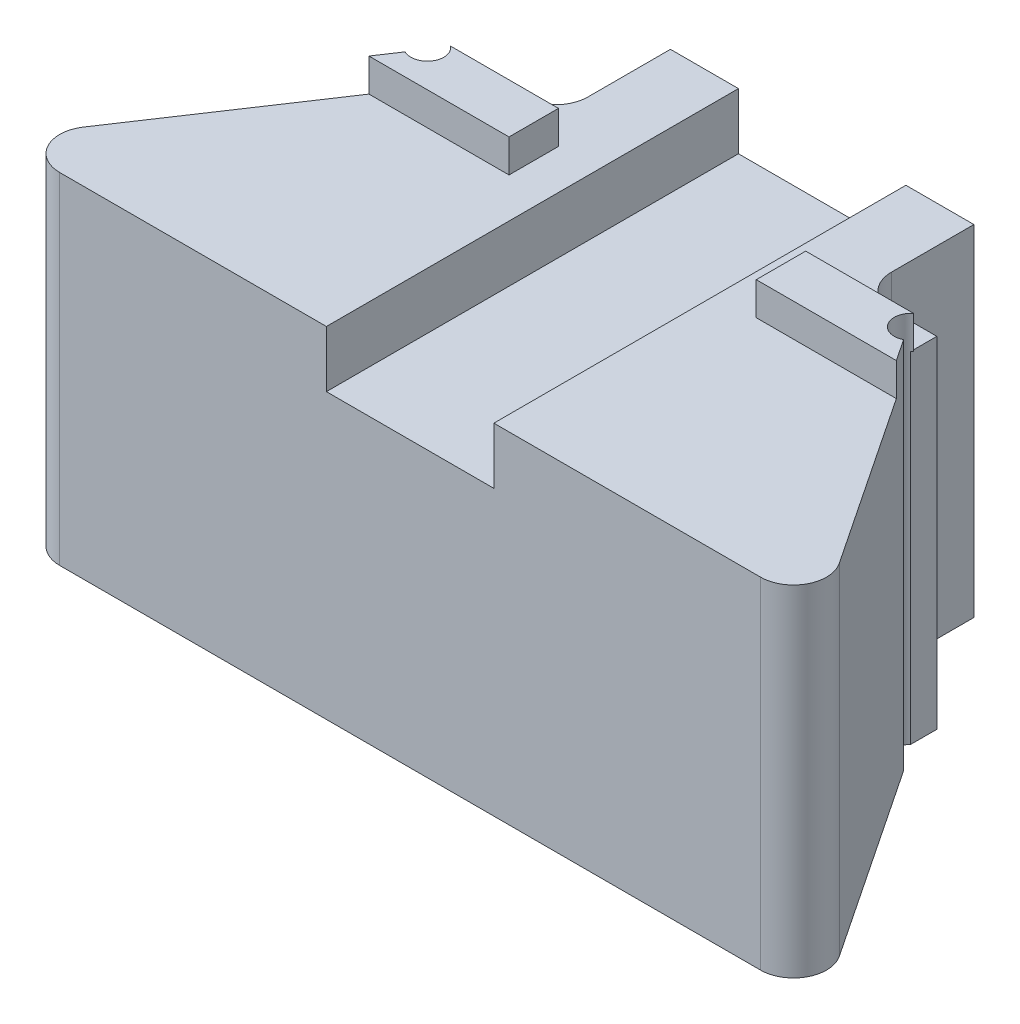
ISO-10303-21;
HEADER;
FILE_DESCRIPTION(('STEP AP214'),'2;1');
FILE_NAME('part.step','',(''),(''),'','','');
FILE_SCHEMA(('AUTOMOTIVE_DESIGN { 1 0 10303 214 1 1 1 1 }'));
ENDSEC;
DATA;
#1=APPLICATION_CONTEXT('core data for automotive mechanical design processes');
#2=APPLICATION_PROTOCOL_DEFINITION('international standard','automotive_design',2000,#1);
#3=PRODUCT_CONTEXT('',#1,'mechanical');
#4=PRODUCT('Part','Part','',(#3));
#5=PRODUCT_RELATED_PRODUCT_CATEGORY('part','',(#4));
#6=PRODUCT_DEFINITION_FORMATION('','',#4);
#7=PRODUCT_DEFINITION_CONTEXT('part definition',#1,'design');
#8=PRODUCT_DEFINITION('design','',#6,#7);
#9=PRODUCT_DEFINITION_SHAPE('','',#8);
#10=(LENGTH_UNIT() NAMED_UNIT(*) SI_UNIT(.MILLI.,.METRE.));
#11=(NAMED_UNIT(*) PLANE_ANGLE_UNIT() SI_UNIT($,.RADIAN.));
#12=(NAMED_UNIT(*) SI_UNIT($,.STERADIAN.) SOLID_ANGLE_UNIT());
#13=UNCERTAINTY_MEASURE_WITH_UNIT(LENGTH_MEASURE(1.E-05),#10,'distance_accuracy_value','');
#14=(GEOMETRIC_REPRESENTATION_CONTEXT(3) GLOBAL_UNCERTAINTY_ASSIGNED_CONTEXT((#13)) GLOBAL_UNIT_ASSIGNED_CONTEXT((#10,
#11,#12)) REPRESENTATION_CONTEXT('',''));
#15=CARTESIAN_POINT('',(0.,0.,0.));
#16=DIRECTION('',(0.,0.,1.));
#17=DIRECTION('',(1.,0.,0.));
#18=AXIS2_PLACEMENT_3D('',#15,#16,#17);
#19=CARTESIAN_POINT('',(0.,10.325,0.));
#20=DIRECTION('',(0.,1.,0.));
#21=DIRECTION('',(0.,0.,1.));
#22=AXIS2_PLACEMENT_3D('',#19,#20,#21);
#23=PLANE('',#22);
#24=DIRECTION('',(0.,0.,1.));
#25=VECTOR('',#24,1.);
#26=CARTESIAN_POINT('',(-5.08,10.325,-12.5));
#27=LINE('',#26,#25);
#28=CARTESIAN_POINT('',(-5.08,10.325,-12.5));
#29=VERTEX_POINT('',#28);
#30=CARTESIAN_POINT('',(-5.08,10.325,12.5));
#31=VERTEX_POINT('',#30);
#32=EDGE_CURVE('E252',#29,#31,#27,.T.);
#33=ORIENTED_EDGE('',*,*,#32,.F.);
#34=DIRECTION('',(-1.,0.,0.));
#35=VECTOR('',#34,1.);
#36=CARTESIAN_POINT('',(-9.20625,10.325,-12.5));
#37=LINE('',#36,#35);
#38=CARTESIAN_POINT('',(-9.20625,10.325,-12.5));
#39=VERTEX_POINT('',#38);
#40=EDGE_CURVE('E243',#29,#39,#37,.T.);
#41=ORIENTED_EDGE('',*,*,#40,.T.);
#42=DIRECTION('',(0.,0.,1.));
#43=VECTOR('',#42,1.);
#44=CARTESIAN_POINT('',(-9.20625,10.325,-5.5));
#45=LINE('',#44,#43);
#46=CARTESIAN_POINT('',(-9.20625,10.325,-7.5));
#47=VERTEX_POINT('',#46);
#48=EDGE_CURVE('E372',#39,#47,#45,.T.);
#49=ORIENTED_EDGE('',*,*,#48,.T.);
#50=CARTESIAN_POINT('',(-11.20625,10.325,-7.5));
#51=DIRECTION('',(0.,1.,0.));
#52=DIRECTION('',(0.,0.,1.));
#53=AXIS2_PLACEMENT_3D('',#50,#51,#52);
#54=CIRCLE('',#53,2.);
#55=CARTESIAN_POINT('',(-11.20625,10.325,-5.5));
#56=VERTEX_POINT('',#55);
#57=EDGE_CURVE('E11',#47,#56,#54,.F.);
#58=ORIENTED_EDGE('',*,*,#57,.T.);
#59=DIRECTION('',(-1.,0.,0.));
#60=VECTOR('',#59,1.);
#61=CARTESIAN_POINT('',(-14.20625,10.325,-5.5));
#62=LINE('',#61,#60);
#63=CARTESIAN_POINT('',(-13.95625,10.325,-5.5));
#64=VERTEX_POINT('',#63);
#65=EDGE_CURVE('E375',#56,#64,#62,.T.);
#66=ORIENTED_EDGE('',*,*,#65,.T.);
#67=DIRECTION('',(0.,0.,-1.));
#68=VECTOR('',#67,1.);
#69=CARTESIAN_POINT('',(-13.95625,10.325,0.));
#70=LINE('',#69,#68);
#71=CARTESIAN_POINT('',(-13.95625,10.325,-4.00000000000001));
#72=VERTEX_POINT('',#71);
#73=EDGE_CURVE('E352',#72,#64,#70,.T.);
#74=ORIENTED_EDGE('',*,*,#73,.F.);
#75=DIRECTION('',(-1.,0.,0.));
#76=VECTOR('',#75,1.);
#77=CARTESIAN_POINT('',(-14.0539961789487,10.325,-4.));
#78=LINE('',#77,#76);
#79=CARTESIAN_POINT('',(-7.49999999999999,10.325,-4.00000000000001));
#80=VERTEX_POINT('',#79);
#81=EDGE_CURVE('E56',#80,#72,#78,.T.);
#82=ORIENTED_EDGE('',*,*,#81,.F.);
#83=DIRECTION('',(0.,0.,-1.));
#84=VECTOR('',#83,1.);
#85=CARTESIAN_POINT('',(-7.49999999999999,10.325,-4.00000000000001));
#86=LINE('',#85,#84);
#87=CARTESIAN_POINT('',(-7.49999999999999,10.325,-1.00000000000001));
#88=VERTEX_POINT('',#87);
#89=EDGE_CURVE('E312',#88,#80,#86,.T.);
#90=ORIENTED_EDGE('',*,*,#89,.F.);
#91=DIRECTION('',(1.,0.,0.));
#92=VECTOR('',#91,1.);
#93=CARTESIAN_POINT('',(-7.49999999999999,10.325,-1.00000000000001));
#94=LINE('',#93,#92);
#95=CARTESIAN_POINT('',(-16.,10.325,-1.));
#96=VERTEX_POINT('',#95);
#97=EDGE_CURVE('E309',#96,#88,#94,.T.);
#98=ORIENTED_EDGE('',*,*,#97,.F.);
#99=DIRECTION('',(-0.554700196225229,0.,0.832050294337844));
#100=VECTOR('',#99,1.);
#101=CARTESIAN_POINT('',(-15.,10.325,-2.49999999999999));
#102=LINE('',#101,#100);
#103=CARTESIAN_POINT('',(-22.927066405033,10.325,9.39059960754956));
#104=VERTEX_POINT('',#103);
#105=EDGE_CURVE('E378',#96,#104,#102,.T.);
#106=ORIENTED_EDGE('',*,*,#105,.T.);
#107=CARTESIAN_POINT('',(-21.2629658163573,10.325,10.5));
#108=DIRECTION('',(0.,1.,0.));
#109=DIRECTION('',(0.,0.,1.));
#110=AXIS2_PLACEMENT_3D('',#107,#108,#109);
#111=CIRCLE('',#110,2.);
#112=CARTESIAN_POINT('',(-21.2629658163573,10.325,12.5));
#113=VERTEX_POINT('',#112);
#114=EDGE_CURVE('E428',#104,#113,#111,.T.);
#115=ORIENTED_EDGE('',*,*,#114,.T.);
#116=DIRECTION('',(1.,0.,0.));
#117=VECTOR('',#116,1.);
#118=CARTESIAN_POINT('',(-25.,10.325,12.5));
#119=LINE('',#118,#117);
#120=EDGE_CURVE('E357',#113,#31,#119,.T.);
#121=ORIENTED_EDGE('',*,*,#120,.T.);
#122=EDGE_LOOP('',(#33,#41,#49,#58,#66,#74,#82,#90,#98,#106,#115,#121));
#123=FACE_BOUND('',#122,.T.);
#124=ADVANCED_FACE('F33',(#123),#23,.T.);
#125=DIRECTION('',(0.,0.,1.));
#126=VECTOR('',#125,1.);
#127=CARTESIAN_POINT('',(5.08,10.325,-12.5));
#128=LINE('',#127,#126);
#129=CARTESIAN_POINT('',(5.08,10.325,-12.5));
#130=VERTEX_POINT('',#129);
#131=CARTESIAN_POINT('',(5.08,10.325,12.5));
#132=VERTEX_POINT('',#131);
#133=EDGE_CURVE('E255',#130,#132,#128,.T.);
#134=ORIENTED_EDGE('',*,*,#133,.T.);
#135=CARTESIAN_POINT('',(21.2629658163573,10.325,12.5));
#136=VERTEX_POINT('',#135);
#137=EDGE_CURVE('E361',#132,#136,#119,.T.);
#138=ORIENTED_EDGE('',*,*,#137,.T.);
#139=CARTESIAN_POINT('',(21.2629658163573,10.325,10.5));
#140=DIRECTION('',(0.,1.,0.));
#141=DIRECTION('',(0.,0.,1.));
#142=AXIS2_PLACEMENT_3D('',#139,#140,#141);
#143=CIRCLE('',#142,2.);
#144=CARTESIAN_POINT('',(22.927066405033,10.325,9.39059960754954));
#145=VERTEX_POINT('',#144);
#146=EDGE_CURVE('E430',#136,#145,#143,.T.);
#147=ORIENTED_EDGE('',*,*,#146,.T.);
#148=DIRECTION('',(-0.554700196225229,0.,-0.832050294337844));
#149=VECTOR('',#148,1.);
#150=CARTESIAN_POINT('',(15.,10.325,-2.5));
#151=LINE('',#150,#149);
#152=CARTESIAN_POINT('',(16.,10.325,-1.));
#153=VERTEX_POINT('',#152);
#154=EDGE_CURVE('E360',#145,#153,#151,.T.);
#155=ORIENTED_EDGE('',*,*,#154,.T.);
#156=DIRECTION('',(1.,0.,0.));
#157=VECTOR('',#156,1.);
#158=CARTESIAN_POINT('',(7.50000000000001,10.325,-1.00000000000001));
#159=LINE('',#158,#157);
#160=CARTESIAN_POINT('',(7.50000000000001,10.325,-1.00000000000001));
#161=VERTEX_POINT('',#160);
#162=EDGE_CURVE('E263',#161,#153,#159,.T.);
#163=ORIENTED_EDGE('',*,*,#162,.F.);
#164=DIRECTION('',(0.,0.,1.));
#165=VECTOR('',#164,1.);
#166=CARTESIAN_POINT('',(7.50000000000001,10.325,-4.00000000000001));
#167=LINE('',#166,#165);
#168=CARTESIAN_POINT('',(7.50000000000001,10.325,-4.00000000000001));
#169=VERTEX_POINT('',#168);
#170=EDGE_CURVE('E278',#169,#161,#167,.T.);
#171=ORIENTED_EDGE('',*,*,#170,.F.);
#172=DIRECTION('',(-1.,0.,0.));
#173=VECTOR('',#172,1.);
#174=CARTESIAN_POINT('',(14.0539961789487,10.325,-4.));
#175=LINE('',#174,#173);
#176=CARTESIAN_POINT('',(13.95625,10.325,-4.));
#177=VERTEX_POINT('',#176);
#178=EDGE_CURVE('E274',#177,#169,#175,.T.);
#179=ORIENTED_EDGE('',*,*,#178,.F.);
#180=DIRECTION('',(0.,0.,1.));
#181=VECTOR('',#180,1.);
#182=CARTESIAN_POINT('',(13.95625,10.325,0.));
#183=LINE('',#182,#181);
#184=CARTESIAN_POINT('',(13.95625,10.325,-5.5));
#185=VERTEX_POINT('',#184);
#186=EDGE_CURVE('E346',#185,#177,#183,.T.);
#187=ORIENTED_EDGE('',*,*,#186,.F.);
#188=DIRECTION('',(-1.,0.,0.));
#189=VECTOR('',#188,1.);
#190=CARTESIAN_POINT('',(14.20625,10.325,-5.5));
#191=LINE('',#190,#189);
#192=CARTESIAN_POINT('',(11.20625,10.325,-5.5));
#193=VERTEX_POINT('',#192);
#194=EDGE_CURVE('E364',#185,#193,#191,.T.);
#195=ORIENTED_EDGE('',*,*,#194,.T.);
#196=CARTESIAN_POINT('',(11.20625,10.325,-7.5));
#197=DIRECTION('',(0.,1.,0.));
#198=DIRECTION('',(0.,0.,1.));
#199=AXIS2_PLACEMENT_3D('',#196,#197,#198);
#200=CIRCLE('',#199,2.);
#201=CARTESIAN_POINT('',(9.20625,10.325,-7.5));
#202=VERTEX_POINT('',#201);
#203=EDGE_CURVE('E442',#193,#202,#200,.F.);
#204=ORIENTED_EDGE('',*,*,#203,.T.);
#205=DIRECTION('',(0.,0.,-1.));
#206=VECTOR('',#205,1.);
#207=CARTESIAN_POINT('',(9.20625,10.325,-5.5));
#208=LINE('',#207,#206);
#209=CARTESIAN_POINT('',(9.20625,10.325,-12.5));
#210=VERTEX_POINT('',#209);
#211=EDGE_CURVE('E367',#202,#210,#208,.T.);
#212=ORIENTED_EDGE('',*,*,#211,.T.);
#213=EDGE_CURVE('E369',#210,#130,#37,.T.);
#214=ORIENTED_EDGE('',*,*,#213,.T.);
#215=EDGE_LOOP('',(#134,#138,#147,#155,#163,#171,#179,#187,#195,#204,#212,#214));
#216=FACE_BOUND('',#215,.T.);
#217=ADVANCED_FACE('F514',(#216),#23,.T.);
#218=CARTESIAN_POINT('',(25.,10.325,12.5));
#219=DIRECTION('',(0.,0.,-1.));
#220=DIRECTION('',(-1.,0.,0.));
#221=AXIS2_PLACEMENT_3D('',#218,#219,#220);
#222=PLANE('',#221);
#223=DIRECTION('',(1.,0.,0.));
#224=VECTOR('',#223,1.);
#225=CARTESIAN_POINT('',(-5.07999999999999,6.9,12.5));
#226=LINE('',#225,#224);
#227=CARTESIAN_POINT('',(-5.07999999999999,6.9,12.5));
#228=VERTEX_POINT('',#227);
#229=CARTESIAN_POINT('',(5.08000000000001,6.9,12.5));
#230=VERTEX_POINT('',#229);
#231=EDGE_CURVE('E246',#228,#230,#226,.T.);
#232=ORIENTED_EDGE('',*,*,#231,.F.);
#233=DIRECTION('',(0.,-1.,0.));
#234=VECTOR('',#233,1.);
#235=CARTESIAN_POINT('',(-5.08,10.325,12.5));
#236=LINE('',#235,#234);
#237=EDGE_CURVE('E229',#31,#228,#236,.T.);
#238=ORIENTED_EDGE('',*,*,#237,.F.);
#239=ORIENTED_EDGE('',*,*,#120,.F.);
#240=DIRECTION('',(0.,-1.,0.));
#241=VECTOR('',#240,1.);
#242=CARTESIAN_POINT('',(-21.2629658163573,10.325,12.5));
#243=LINE('',#242,#241);
#244=CARTESIAN_POINT('',(-21.2629658163573,-10.325,12.5));
#245=VERTEX_POINT('',#244);
#246=EDGE_CURVE('E422',#113,#245,#243,.T.);
#247=ORIENTED_EDGE('',*,*,#246,.T.);
#248=DIRECTION('',(1.,0.,0.));
#249=VECTOR('',#248,1.);
#250=CARTESIAN_POINT('',(25.,-10.325,12.5));
#251=LINE('',#250,#249);
#252=CARTESIAN_POINT('',(21.2629658163573,-10.325,12.5));
#253=VERTEX_POINT('',#252);
#254=EDGE_CURVE('E356',#245,#253,#251,.T.);
#255=ORIENTED_EDGE('',*,*,#254,.T.);
#256=DIRECTION('',(0.,-1.,0.));
#257=VECTOR('',#256,1.);
#258=CARTESIAN_POINT('',(21.2629658163573,10.325,12.5));
#259=LINE('',#258,#257);
#260=EDGE_CURVE('E425',#253,#136,#259,.F.);
#261=ORIENTED_EDGE('',*,*,#260,.T.);
#262=ORIENTED_EDGE('',*,*,#137,.F.);
#263=DIRECTION('',(0.,1.,0.));
#264=VECTOR('',#263,1.);
#265=CARTESIAN_POINT('',(5.08,10.325,12.5));
#266=LINE('',#265,#264);
#267=EDGE_CURVE('E244',#230,#132,#266,.T.);
#268=ORIENTED_EDGE('',*,*,#267,.F.);
#269=EDGE_LOOP('',(#232,#238,#239,#247,#255,#261,#262,#268));
#270=FACE_BOUND('',#269,.T.);
#271=ADVANCED_FACE('F492',(#270),#222,.F.);
#272=CARTESIAN_POINT('',(15.,10.325,-2.5));
#273=DIRECTION('',(-0.832050294337844,0.,0.554700196225229));
#274=DIRECTION('',(0.554700196225229,0.,0.832050294337844));
#275=AXIS2_PLACEMENT_3D('',#272,#273,#274);
#276=PLANE('',#275);
#277=ORIENTED_EDGE('',*,*,#154,.F.);
#278=DIRECTION('',(0.,-1.,0.));
#279=VECTOR('',#278,1.);
#280=CARTESIAN_POINT('',(22.927066405033,10.325,9.39059960754954));
#281=LINE('',#280,#279);
#282=CARTESIAN_POINT('',(22.927066405033,-10.325,9.39059960754954));
#283=VERTEX_POINT('',#282);
#284=EDGE_CURVE('E415',#145,#283,#281,.T.);
#285=ORIENTED_EDGE('',*,*,#284,.T.);
#286=DIRECTION('',(-0.554700196225229,0.,-0.832050294337844));
#287=VECTOR('',#286,1.);
#288=CARTESIAN_POINT('',(15.,-10.325,-2.5));
#289=LINE('',#288,#287);
#290=CARTESIAN_POINT('',(15.1212626139406,-10.325,-2.31810607908907));
#291=VERTEX_POINT('',#290);
#292=EDGE_CURVE('E383',#283,#291,#289,.T.);
#293=ORIENTED_EDGE('',*,*,#292,.T.);
#294=DIRECTION('',(0.,1.,0.));
#295=VECTOR('',#294,1.);
#296=CARTESIAN_POINT('',(15.1212626139406,-10.325,-2.31810607908907));
#297=LINE('',#296,#295);
#298=CARTESIAN_POINT('',(15.1212626139406,12.325,-2.31810607908907));
#299=VERTEX_POINT('',#298);
#300=EDGE_CURVE('E336',#291,#299,#297,.T.);
#301=ORIENTED_EDGE('',*,*,#300,.T.);
#302=DIRECTION('',(-0.554700196225228,0.,-0.832050294337844));
#303=VECTOR('',#302,1.);
#304=CARTESIAN_POINT('',(16.,12.325,-1.));
#305=LINE('',#304,#303);
#306=CARTESIAN_POINT('',(16.,12.325,-1.));
#307=VERTEX_POINT('',#306);
#308=EDGE_CURVE('E269',#307,#299,#305,.T.);
#309=ORIENTED_EDGE('',*,*,#308,.F.);
#310=DIRECTION('',(0.,-1.,0.));
#311=VECTOR('',#310,1.);
#312=CARTESIAN_POINT('',(16.,12.325,-1.));
#313=LINE('',#312,#311);
#314=EDGE_CURVE('E272',#307,#153,#313,.T.);
#315=ORIENTED_EDGE('',*,*,#314,.T.);
#316=EDGE_LOOP('',(#277,#285,#293,#301,#309,#315));
#317=FACE_BOUND('',#316,.T.);
#318=ADVANCED_FACE('F541',(#317),#276,.F.);
#319=CARTESIAN_POINT('',(14.20625,10.325,-5.5));
#320=DIRECTION('',(0.,0.,1.));
#321=DIRECTION('',(1.,0.,0.));
#322=AXIS2_PLACEMENT_3D('',#319,#320,#321);
#323=PLANE('',#322);
#324=DIRECTION('',(-1.,0.,0.));
#325=VECTOR('',#324,1.);
#326=CARTESIAN_POINT('',(14.20625,-10.325,-5.5));
#327=LINE('',#326,#325);
#328=CARTESIAN_POINT('',(13.95625,-10.325,-5.5));
#329=VERTEX_POINT('',#328);
#330=CARTESIAN_POINT('',(11.20625,-10.325,-5.5));
#331=VERTEX_POINT('',#330);
#332=EDGE_CURVE('E385',#329,#331,#327,.T.);
#333=ORIENTED_EDGE('',*,*,#332,.T.);
#334=DIRECTION('',(0.,-1.,0.));
#335=VECTOR('',#334,1.);
#336=CARTESIAN_POINT('',(11.20625,10.325,-5.5));
#337=LINE('',#336,#335);
#338=EDGE_CURVE('E413',#331,#193,#337,.F.);
#339=ORIENTED_EDGE('',*,*,#338,.T.);
#340=ORIENTED_EDGE('',*,*,#194,.F.);
#341=DIRECTION('',(0.,1.,0.));
#342=VECTOR('',#341,1.);
#343=CARTESIAN_POINT('',(13.95625,-10.325,-5.5));
#344=LINE('',#343,#342);
#345=EDGE_CURVE('E343',#329,#185,#344,.T.);
#346=ORIENTED_EDGE('',*,*,#345,.F.);
#347=EDGE_LOOP('',(#333,#339,#340,#346));
#348=FACE_BOUND('',#347,.T.);
#349=ADVANCED_FACE('F537',(#348),#323,.F.);
#350=CARTESIAN_POINT('',(9.20625,10.325,-5.5));
#351=DIRECTION('',(-1.,0.,0.));
#352=DIRECTION('',(0.,0.,1.));
#353=AXIS2_PLACEMENT_3D('',#350,#351,#352);
#354=PLANE('',#353);
#355=ORIENTED_EDGE('',*,*,#211,.F.);
#356=DIRECTION('',(0.,-1.,0.));
#357=VECTOR('',#356,1.);
#358=CARTESIAN_POINT('',(9.20625,-10.325,-7.5));
#359=LINE('',#358,#357);
#360=CARTESIAN_POINT('',(9.20625,-10.325,-7.5));
#361=VERTEX_POINT('',#360);
#362=EDGE_CURVE('E410',#202,#361,#359,.T.);
#363=ORIENTED_EDGE('',*,*,#362,.T.);
#364=DIRECTION('',(0.,0.,-1.));
#365=VECTOR('',#364,1.);
#366=CARTESIAN_POINT('',(9.20625,-10.325,-5.5));
#367=LINE('',#366,#365);
#368=CARTESIAN_POINT('',(9.20625,-10.325,-12.5));
#369=VERTEX_POINT('',#368);
#370=EDGE_CURVE('E388',#361,#369,#367,.T.);
#371=ORIENTED_EDGE('',*,*,#370,.T.);
#372=DIRECTION('',(0.,-1.,0.));
#373=VECTOR('',#372,1.);
#374=CARTESIAN_POINT('',(9.20625,10.325,-12.5));
#375=LINE('',#374,#373);
#376=EDGE_CURVE('E402',#210,#369,#375,.T.);
#377=ORIENTED_EDGE('',*,*,#376,.F.);
#378=EDGE_LOOP('',(#355,#363,#371,#377));
#379=FACE_BOUND('',#378,.T.);
#380=ADVANCED_FACE('F534',(#379),#354,.F.);
#381=CARTESIAN_POINT('',(-9.20625,10.325,-12.5));
#382=DIRECTION('',(0.,0.,1.));
#383=DIRECTION('',(1.,0.,0.));
#384=AXIS2_PLACEMENT_3D('',#381,#382,#383);
#385=PLANE('',#384);
#386=ORIENTED_EDGE('',*,*,#40,.F.);
#387=DIRECTION('',(0.,-1.,0.));
#388=VECTOR('',#387,1.);
#389=CARTESIAN_POINT('',(-5.08,10.325,-12.5));
#390=LINE('',#389,#388);
#391=CARTESIAN_POINT('',(-5.07999999999999,6.9,-12.5));
#392=VERTEX_POINT('',#391);
#393=EDGE_CURVE('E226',#29,#392,#390,.T.);
#394=ORIENTED_EDGE('',*,*,#393,.T.);
#395=DIRECTION('',(1.,0.,0.));
#396=VECTOR('',#395,1.);
#397=CARTESIAN_POINT('',(-5.07999999999999,6.9,-12.5));
#398=LINE('',#397,#396);
#399=CARTESIAN_POINT('',(5.08000000000001,6.9,-12.5));
#400=VERTEX_POINT('',#399);
#401=EDGE_CURVE('E236',#392,#400,#398,.T.);
#402=ORIENTED_EDGE('',*,*,#401,.T.);
#403=DIRECTION('',(0.,1.,0.));
#404=VECTOR('',#403,1.);
#405=CARTESIAN_POINT('',(5.08,10.325,-12.5));
#406=LINE('',#405,#404);
#407=EDGE_CURVE('E48',#400,#130,#406,.T.);
#408=ORIENTED_EDGE('',*,*,#407,.T.);
#409=ORIENTED_EDGE('',*,*,#213,.F.);
#410=ORIENTED_EDGE('',*,*,#376,.T.);
#411=DIRECTION('',(-1.,0.,0.));
#412=VECTOR('',#411,1.);
#413=CARTESIAN_POINT('',(-9.20625,-10.325,-12.5));
#414=LINE('',#413,#412);
#415=CARTESIAN_POINT('',(-9.20625,-10.325,-12.5));
#416=VERTEX_POINT('',#415);
#417=EDGE_CURVE('E390',#369,#416,#414,.T.);
#418=ORIENTED_EDGE('',*,*,#417,.T.);
#419=DIRECTION('',(0.,-1.,0.));
#420=VECTOR('',#419,1.);
#421=CARTESIAN_POINT('',(-9.20625,10.325,-12.5));
#422=LINE('',#421,#420);
#423=EDGE_CURVE('E380',#39,#416,#422,.T.);
#424=ORIENTED_EDGE('',*,*,#423,.F.);
#425=EDGE_LOOP('',(#386,#394,#402,#408,#409,#410,#418,#424));
#426=FACE_BOUND('',#425,.T.);
#427=ADVANCED_FACE('F241',(#426),#385,.F.);
#428=CARTESIAN_POINT('',(-9.20625,10.325,-5.5));
#429=DIRECTION('',(1.,0.,0.));
#430=DIRECTION('',(0.,0.,-1.));
#431=AXIS2_PLACEMENT_3D('',#428,#429,#430);
#432=PLANE('',#431);
#433=DIRECTION('',(0.,0.,1.));
#434=VECTOR('',#433,1.);
#435=CARTESIAN_POINT('',(-9.20625,-10.325,-5.5));
#436=LINE('',#435,#434);
#437=CARTESIAN_POINT('',(-9.20625,-10.325,-7.5));
#438=VERTEX_POINT('',#437);
#439=EDGE_CURVE('E392',#416,#438,#436,.T.);
#440=ORIENTED_EDGE('',*,*,#439,.T.);
#441=DIRECTION('',(0.,-1.,0.));
#442=VECTOR('',#441,1.);
#443=CARTESIAN_POINT('',(-9.20625,10.325,-7.5));
#444=LINE('',#443,#442);
#445=EDGE_CURVE('E435',#438,#47,#444,.F.);
#446=ORIENTED_EDGE('',*,*,#445,.T.);
#447=ORIENTED_EDGE('',*,*,#48,.F.);
#448=ORIENTED_EDGE('',*,*,#423,.T.);
#449=EDGE_LOOP('',(#440,#446,#447,#448));
#450=FACE_BOUND('',#449,.T.);
#451=ADVANCED_FACE('F453',(#450),#432,.F.);
#452=CARTESIAN_POINT('',(-14.20625,10.325,-5.5));
#453=DIRECTION('',(0.,0.,1.));
#454=DIRECTION('',(1.,0.,0.));
#455=AXIS2_PLACEMENT_3D('',#452,#453,#454);
#456=PLANE('',#455);
#457=ORIENTED_EDGE('',*,*,#65,.F.);
#458=DIRECTION('',(0.,-1.,0.));
#459=VECTOR('',#458,1.);
#460=CARTESIAN_POINT('',(-11.20625,-10.325,-5.5));
#461=LINE('',#460,#459);
#462=CARTESIAN_POINT('',(-11.20625,-10.325,-5.5));
#463=VERTEX_POINT('',#462);
#464=EDGE_CURVE('E432',#56,#463,#461,.T.);
#465=ORIENTED_EDGE('',*,*,#464,.T.);
#466=DIRECTION('',(-1.,0.,0.));
#467=VECTOR('',#466,1.);
#468=CARTESIAN_POINT('',(-14.20625,-10.325,-5.5));
#469=LINE('',#468,#467);
#470=CARTESIAN_POINT('',(-13.95625,-10.325,-5.5));
#471=VERTEX_POINT('',#470);
#472=EDGE_CURVE('E395',#463,#471,#469,.T.);
#473=ORIENTED_EDGE('',*,*,#472,.T.);
#474=DIRECTION('',(0.,1.,0.));
#475=VECTOR('',#474,1.);
#476=CARTESIAN_POINT('',(-13.95625,-10.325,-5.5));
#477=LINE('',#476,#475);
#478=EDGE_CURVE('E342',#471,#64,#477,.T.);
#479=ORIENTED_EDGE('',*,*,#478,.T.);
#480=EDGE_LOOP('',(#457,#465,#473,#479));
#481=FACE_BOUND('',#480,.T.);
#482=ADVANCED_FACE('F459',(#481),#456,.F.);
#483=CARTESIAN_POINT('',(-15.,10.325,-2.49999999999999));
#484=DIRECTION('',(0.832050294337844,0.,0.554700196225229));
#485=DIRECTION('',(0.554700196225229,0.,-0.832050294337844));
#486=AXIS2_PLACEMENT_3D('',#483,#484,#485);
#487=PLANE('',#486);
#488=DIRECTION('',(-0.554700196225229,0.,0.832050294337844));
#489=VECTOR('',#488,1.);
#490=CARTESIAN_POINT('',(-15.,-10.325,-2.49999999999999));
#491=LINE('',#490,#489);
#492=CARTESIAN_POINT('',(-15.1212626139406,-10.325,-2.31810607908907));
#493=VERTEX_POINT('',#492);
#494=CARTESIAN_POINT('',(-22.927066405033,-10.325,9.39059960754956));
#495=VERTEX_POINT('',#494);
#496=EDGE_CURVE('E397',#493,#495,#491,.T.);
#497=ORIENTED_EDGE('',*,*,#496,.T.);
#498=DIRECTION('',(0.,-1.,0.));
#499=VECTOR('',#498,1.);
#500=CARTESIAN_POINT('',(-22.927066405033,10.325,9.39059960754955));
#501=LINE('',#500,#499);
#502=EDGE_CURVE('E437',#495,#104,#501,.F.);
#503=ORIENTED_EDGE('',*,*,#502,.T.);
#504=ORIENTED_EDGE('',*,*,#105,.F.);
#505=DIRECTION('',(0.,-1.,0.));
#506=VECTOR('',#505,1.);
#507=CARTESIAN_POINT('',(-16.,12.325,-1.));
#508=LINE('',#507,#506);
#509=CARTESIAN_POINT('',(-16.,12.325,-1.));
#510=VERTEX_POINT('',#509);
#511=EDGE_CURVE('E324',#510,#96,#508,.T.);
#512=ORIENTED_EDGE('',*,*,#511,.F.);
#513=DIRECTION('',(-0.554700196225229,0.,0.832050294337843));
#514=VECTOR('',#513,1.);
#515=CARTESIAN_POINT('',(-15.1212626139406,12.325,-2.31810607908907));
#516=LINE('',#515,#514);
#517=CARTESIAN_POINT('',(-15.1212626139406,12.325,-2.31810607908907));
#518=VERTEX_POINT('',#517);
#519=EDGE_CURVE('E298',#518,#510,#516,.T.);
#520=ORIENTED_EDGE('',*,*,#519,.F.);
#521=DIRECTION('',(0.,1.,0.));
#522=VECTOR('',#521,1.);
#523=CARTESIAN_POINT('',(-15.1212626139406,-10.325,-2.31810607908907));
#524=LINE('',#523,#522);
#525=EDGE_CURVE('E331',#518,#493,#524,.F.);
#526=ORIENTED_EDGE('',*,*,#525,.T.);
#527=EDGE_LOOP('',(#497,#503,#504,#512,#520,#526));
#528=FACE_BOUND('',#527,.T.);
#529=ADVANCED_FACE('F485',(#528),#487,.F.);
#530=CARTESIAN_POINT('',(0.,-10.325,0.));
#531=DIRECTION('',(0.,1.,0.));
#532=DIRECTION('',(0.,0.,1.));
#533=AXIS2_PLACEMENT_3D('',#530,#531,#532);
#534=PLANE('',#533);
#535=ORIENTED_EDGE('',*,*,#292,.F.);
#536=CARTESIAN_POINT('',(21.2629658163573,-10.325,10.5));
#537=DIRECTION('',(0.,1.,0.));
#538=DIRECTION('',(0.,0.,1.));
#539=AXIS2_PLACEMENT_3D('',#536,#537,#538);
#540=CIRCLE('',#539,2.);
#541=EDGE_CURVE('E420',#283,#253,#540,.F.);
#542=ORIENTED_EDGE('',*,*,#541,.T.);
#543=ORIENTED_EDGE('',*,*,#254,.F.);
#544=CARTESIAN_POINT('',(-21.2629658163573,-10.325,10.5));
#545=DIRECTION('',(0.,1.,0.));
#546=DIRECTION('',(0.,0.,1.));
#547=AXIS2_PLACEMENT_3D('',#544,#545,#546);
#548=CIRCLE('',#547,2.);
#549=EDGE_CURVE('E418',#245,#495,#548,.F.);
#550=ORIENTED_EDGE('',*,*,#549,.T.);
#551=ORIENTED_EDGE('',*,*,#496,.F.);
#552=CARTESIAN_POINT('',(-14.6633567811865,-10.325,-3.20710678118655));
#553=DIRECTION('',(0.,1.,0.));
#554=DIRECTION('',(0.,0.,1.));
#555=AXIS2_PLACEMENT_3D('',#552,#553,#554);
#556=CIRCLE('',#555,1.);
#557=CARTESIAN_POINT('',(-13.95625,-10.325,-3.9142135623731));
#558=VERTEX_POINT('',#557);
#559=EDGE_CURVE('E328',#493,#558,#556,.T.);
#560=ORIENTED_EDGE('',*,*,#559,.T.);
#561=DIRECTION('',(0.,0.,-1.));
#562=VECTOR('',#561,1.);
#563=CARTESIAN_POINT('',(-13.95625,-10.325,-5.5));
#564=LINE('',#563,#562);
#565=EDGE_CURVE('E339',#558,#471,#564,.T.);
#566=ORIENTED_EDGE('',*,*,#565,.T.);
#567=ORIENTED_EDGE('',*,*,#472,.F.);
#568=CARTESIAN_POINT('',(-11.20625,-10.325,-7.5));
#569=DIRECTION('',(0.,1.,0.));
#570=DIRECTION('',(0.,0.,1.));
#571=AXIS2_PLACEMENT_3D('',#568,#569,#570);
#572=CIRCLE('',#571,2.);
#573=EDGE_CURVE('E41',#463,#438,#572,.T.);
#574=ORIENTED_EDGE('',*,*,#573,.T.);
#575=ORIENTED_EDGE('',*,*,#439,.F.);
#576=ORIENTED_EDGE('',*,*,#417,.F.);
#577=ORIENTED_EDGE('',*,*,#370,.F.);
#578=CARTESIAN_POINT('',(11.20625,-10.325,-7.5));
#579=DIRECTION('',(0.,1.,0.));
#580=DIRECTION('',(0.,0.,1.));
#581=AXIS2_PLACEMENT_3D('',#578,#579,#580);
#582=CIRCLE('',#581,2.);
#583=EDGE_CURVE('E440',#361,#331,#582,.T.);
#584=ORIENTED_EDGE('',*,*,#583,.T.);
#585=ORIENTED_EDGE('',*,*,#332,.F.);
#586=DIRECTION('',(0.,0.,1.));
#587=VECTOR('',#586,1.);
#588=CARTESIAN_POINT('',(13.95625,-10.325,-5.5));
#589=LINE('',#588,#587);
#590=CARTESIAN_POINT('',(13.95625,-10.325,-3.9142135623731));
#591=VERTEX_POINT('',#590);
#592=EDGE_CURVE('E338',#329,#591,#589,.T.);
#593=ORIENTED_EDGE('',*,*,#592,.T.);
#594=CARTESIAN_POINT('',(14.6633567811865,-10.325,-3.20710678118655));
#595=DIRECTION('',(0.,1.,0.));
#596=DIRECTION('',(0.,0.,-1.));
#597=AXIS2_PLACEMENT_3D('',#594,#595,#596);
#598=CIRCLE('',#597,1.);
#599=EDGE_CURVE('E327',#591,#291,#598,.T.);
#600=ORIENTED_EDGE('',*,*,#599,.T.);
#601=EDGE_LOOP('',(#535,#542,#543,#550,#551,#560,#566,#567,#574,#575,#576,#577,#584,#585,#593,#600));
#602=FACE_BOUND('',#601,.T.);
#603=ADVANCED_FACE('F447',(#602),#534,.F.);
#604=CARTESIAN_POINT('',(13.95625,-10.325,-5.5));
#605=DIRECTION('',(-1.,0.,0.));
#606=DIRECTION('',(0.,0.,1.));
#607=AXIS2_PLACEMENT_3D('',#604,#605,#606);
#608=PLANE('',#607);
#609=ORIENTED_EDGE('',*,*,#186,.T.);
#610=DIRECTION('',(0.,0.,-1.));
#611=VECTOR('',#610,1.);
#612=CARTESIAN_POINT('',(13.95625,10.325,-5.5));
#613=LINE('',#612,#611);
#614=CARTESIAN_POINT('',(13.95625,10.325,-3.9142135623731));
#615=VERTEX_POINT('',#614);
#616=EDGE_CURVE('E292',#615,#177,#613,.T.);
#617=ORIENTED_EDGE('',*,*,#616,.F.);
#618=DIRECTION('',(0.,1.,0.));
#619=VECTOR('',#618,1.);
#620=CARTESIAN_POINT('',(13.95625,-10.325,-3.9142135623731));
#621=LINE('',#620,#619);
#622=EDGE_CURVE('E407',#615,#591,#621,.F.);
#623=ORIENTED_EDGE('',*,*,#622,.T.);
#624=ORIENTED_EDGE('',*,*,#592,.F.);
#625=ORIENTED_EDGE('',*,*,#345,.T.);
#626=EDGE_LOOP('',(#609,#617,#623,#624,#625));
#627=FACE_BOUND('',#626,.T.);
#628=ADVANCED_FACE('F522',(#627),#608,.F.);
#629=CARTESIAN_POINT('',(-13.95625,-10.325,-5.5));
#630=DIRECTION('',(1.,0.,0.));
#631=DIRECTION('',(0.,0.,-1.));
#632=AXIS2_PLACEMENT_3D('',#629,#630,#631);
#633=PLANE('',#632);
#634=ORIENTED_EDGE('',*,*,#565,.F.);
#635=DIRECTION('',(0.,1.,0.));
#636=VECTOR('',#635,1.);
#637=CARTESIAN_POINT('',(-13.95625,-10.325,-3.9142135623731));
#638=LINE('',#637,#636);
#639=CARTESIAN_POINT('',(-13.95625,10.325,-3.9142135623731));
#640=VERTEX_POINT('',#639);
#641=EDGE_CURVE('E405',#558,#640,#638,.T.);
#642=ORIENTED_EDGE('',*,*,#641,.T.);
#643=EDGE_CURVE('E353',#640,#72,#70,.T.);
#644=ORIENTED_EDGE('',*,*,#643,.T.);
#645=ORIENTED_EDGE('',*,*,#73,.T.);
#646=ORIENTED_EDGE('',*,*,#478,.F.);
#647=EDGE_LOOP('',(#634,#642,#644,#645,#646));
#648=FACE_BOUND('',#647,.T.);
#649=ADVANCED_FACE('F463',(#648),#633,.F.);
#650=CARTESIAN_POINT('',(-14.6633567811865,-10.325,-3.20710678118655));
#651=DIRECTION('',(0.,1.,0.));
#652=DIRECTION('',(0.,0.,1.));
#653=AXIS2_PLACEMENT_3D('',#650,#651,#652);
#654=CYLINDRICAL_SURFACE('',#653,1.);
#655=ORIENTED_EDGE('',*,*,#559,.F.);
#656=ORIENTED_EDGE('',*,*,#525,.F.);
#657=CARTESIAN_POINT('',(-14.6633567811865,12.325,-3.20710678118655));
#658=DIRECTION('',(0.,-1.,0.));
#659=DIRECTION('',(0.,0.,-1.));
#660=AXIS2_PLACEMENT_3D('',#657,#658,#659);
#661=CIRCLE('',#660,1.);
#662=CARTESIAN_POINT('',(-14.0539961789487,12.325,-4.));
#663=VERTEX_POINT('',#662);
#664=EDGE_CURVE('E295',#663,#518,#661,.T.);
#665=ORIENTED_EDGE('',*,*,#664,.F.);
#666=DIRECTION('',(0.,-1.,0.));
#667=VECTOR('',#666,1.);
#668=CARTESIAN_POINT('',(-14.0539961789487,12.325,-4.));
#669=LINE('',#668,#667);
#670=CARTESIAN_POINT('',(-14.0539961789487,10.325,-4.));
#671=VERTEX_POINT('',#670);
#672=EDGE_CURVE('E306',#663,#671,#669,.T.);
#673=ORIENTED_EDGE('',*,*,#672,.T.);
#674=CARTESIAN_POINT('',(-14.6633567811865,10.325,-3.20710678118655));
#675=DIRECTION('',(0.,-1.,0.));
#676=DIRECTION('',(0.,0.,-1.));
#677=AXIS2_PLACEMENT_3D('',#674,#675,#676);
#678=CIRCLE('',#677,1.);
#679=EDGE_CURVE('E294',#671,#640,#678,.T.);
#680=ORIENTED_EDGE('',*,*,#679,.T.);
#681=ORIENTED_EDGE('',*,*,#641,.F.);
#682=EDGE_LOOP('',(#655,#656,#665,#673,#680,#681));
#683=FACE_BOUND('',#682,.T.);
#684=ADVANCED_FACE('F497',(#683),#654,.F.);
#685=CARTESIAN_POINT('',(14.6633567811865,-10.325,-3.20710678118655));
#686=DIRECTION('',(0.,1.,0.));
#687=DIRECTION('',(0.,0.,1.));
#688=AXIS2_PLACEMENT_3D('',#685,#686,#687);
#689=CYLINDRICAL_SURFACE('',#688,1.);
#690=ORIENTED_EDGE('',*,*,#599,.F.);
#691=ORIENTED_EDGE('',*,*,#622,.F.);
#692=CARTESIAN_POINT('',(14.6633567811865,10.325,-3.20710678118655));
#693=DIRECTION('',(0.,-1.,0.));
#694=DIRECTION('',(0.,0.,1.));
#695=AXIS2_PLACEMENT_3D('',#692,#693,#694);
#696=CIRCLE('',#695,1.);
#697=CARTESIAN_POINT('',(14.0539961789487,10.325,-4.));
#698=VERTEX_POINT('',#697);
#699=EDGE_CURVE('E254',#615,#698,#696,.T.);
#700=ORIENTED_EDGE('',*,*,#699,.T.);
#701=DIRECTION('',(0.,-1.,0.));
#702=VECTOR('',#701,1.);
#703=CARTESIAN_POINT('',(14.0539961789487,12.325,-4.));
#704=LINE('',#703,#702);
#705=CARTESIAN_POINT('',(14.0539961789487,12.325,-4.));
#706=VERTEX_POINT('',#705);
#707=EDGE_CURVE('E289',#706,#698,#704,.T.);
#708=ORIENTED_EDGE('',*,*,#707,.F.);
#709=CARTESIAN_POINT('',(14.6633567811865,12.325,-3.20710678118655));
#710=DIRECTION('',(0.,-1.,0.));
#711=DIRECTION('',(0.,0.,1.));
#712=AXIS2_PLACEMENT_3D('',#709,#710,#711);
#713=CIRCLE('',#712,1.);
#714=EDGE_CURVE('E259',#299,#706,#713,.T.);
#715=ORIENTED_EDGE('',*,*,#714,.F.);
#716=ORIENTED_EDGE('',*,*,#300,.F.);
#717=EDGE_LOOP('',(#690,#691,#700,#708,#715,#716));
#718=FACE_BOUND('',#717,.T.);
#719=ADVANCED_FACE('F552',(#718),#689,.F.);
#720=CARTESIAN_POINT('',(11.20625,10.325,-7.5));
#721=DIRECTION('',(0.,1.,0.));
#722=DIRECTION('',(0.,0.,1.));
#723=AXIS2_PLACEMENT_3D('',#720,#721,#722);
#724=CYLINDRICAL_SURFACE('',#723,2.);
#725=ORIENTED_EDGE('',*,*,#203,.F.);
#726=ORIENTED_EDGE('',*,*,#338,.F.);
#727=ORIENTED_EDGE('',*,*,#583,.F.);
#728=ORIENTED_EDGE('',*,*,#362,.F.);
#729=EDGE_LOOP('',(#725,#726,#727,#728));
#730=FACE_BOUND('',#729,.T.);
#731=ADVANCED_FACE('F548',(#730),#724,.F.);
#732=CARTESIAN_POINT('',(21.2629658163573,10.325,10.5));
#733=DIRECTION('',(0.,-1.,0.));
#734=DIRECTION('',(0.,0.,-1.));
#735=AXIS2_PLACEMENT_3D('',#732,#733,#734);
#736=CYLINDRICAL_SURFACE('',#735,2.);
#737=ORIENTED_EDGE('',*,*,#146,.F.);
#738=ORIENTED_EDGE('',*,*,#260,.F.);
#739=ORIENTED_EDGE('',*,*,#541,.F.);
#740=ORIENTED_EDGE('',*,*,#284,.F.);
#741=EDGE_LOOP('',(#737,#738,#739,#740));
#742=FACE_BOUND('',#741,.T.);
#743=ADVANCED_FACE('F551',(#742),#736,.T.);
#744=CARTESIAN_POINT('',(-11.20625,10.325,-7.5));
#745=DIRECTION('',(0.,1.,0.));
#746=DIRECTION('',(0.,0.,1.));
#747=AXIS2_PLACEMENT_3D('',#744,#745,#746);
#748=CYLINDRICAL_SURFACE('',#747,2.);
#749=ORIENTED_EDGE('',*,*,#57,.F.);
#750=ORIENTED_EDGE('',*,*,#445,.F.);
#751=ORIENTED_EDGE('',*,*,#573,.F.);
#752=ORIENTED_EDGE('',*,*,#464,.F.);
#753=EDGE_LOOP('',(#749,#750,#751,#752));
#754=FACE_BOUND('',#753,.T.);
#755=ADVANCED_FACE('F456',(#754),#748,.F.);
#756=CARTESIAN_POINT('',(-21.2629658163573,10.325,10.5));
#757=DIRECTION('',(0.,-1.,0.));
#758=DIRECTION('',(0.,0.,-1.));
#759=AXIS2_PLACEMENT_3D('',#756,#757,#758);
#760=CYLINDRICAL_SURFACE('',#759,2.);
#761=ORIENTED_EDGE('',*,*,#114,.F.);
#762=ORIENTED_EDGE('',*,*,#502,.F.);
#763=ORIENTED_EDGE('',*,*,#549,.F.);
#764=ORIENTED_EDGE('',*,*,#246,.F.);
#765=EDGE_LOOP('',(#761,#762,#763,#764));
#766=FACE_BOUND('',#765,.T.);
#767=ADVANCED_FACE('F35',(#766),#760,.T.);
#768=CARTESIAN_POINT('',(-14.6633567811865,10.325,-3.20710678118655));
#769=DIRECTION('',(0.,-1.,0.));
#770=DIRECTION('',(0.,0.,-1.));
#771=AXIS2_PLACEMENT_3D('',#768,#769,#770);
#772=PLANE('',#771);
#773=ORIENTED_EDGE('',*,*,#643,.F.);
#774=ORIENTED_EDGE('',*,*,#679,.F.);
#775=EDGE_CURVE('E314',#72,#671,#78,.T.);
#776=ORIENTED_EDGE('',*,*,#775,.F.);
#777=EDGE_LOOP('',(#773,#774,#776));
#778=FACE_BOUND('',#777,.T.);
#779=ADVANCED_FACE('F468',(#778),#772,.T.);
#780=CARTESIAN_POINT('',(-7.49999999999999,12.325,-1.00000000000001));
#781=DIRECTION('',(0.,0.,-1.));
#782=DIRECTION('',(-1.,0.,0.));
#783=AXIS2_PLACEMENT_3D('',#780,#781,#782);
#784=PLANE('',#783);
#785=ORIENTED_EDGE('',*,*,#97,.T.);
#786=DIRECTION('',(0.,-1.,0.));
#787=VECTOR('',#786,1.);
#788=CARTESIAN_POINT('',(-7.49999999999999,12.325,-1.00000000000001));
#789=LINE('',#788,#787);
#790=CARTESIAN_POINT('',(-7.49999999999999,12.325,-1.00000000000001));
#791=VERTEX_POINT('',#790);
#792=EDGE_CURVE('E321',#791,#88,#789,.T.);
#793=ORIENTED_EDGE('',*,*,#792,.F.);
#794=DIRECTION('',(1.,0.,0.));
#795=VECTOR('',#794,1.);
#796=CARTESIAN_POINT('',(-7.49999999999999,12.325,-1.00000000000001));
#797=LINE('',#796,#795);
#798=EDGE_CURVE('E300',#510,#791,#797,.T.);
#799=ORIENTED_EDGE('',*,*,#798,.F.);
#800=ORIENTED_EDGE('',*,*,#511,.T.);
#801=EDGE_LOOP('',(#785,#793,#799,#800));
#802=FACE_BOUND('',#801,.T.);
#803=ADVANCED_FACE('F480',(#802),#784,.F.);
#804=CARTESIAN_POINT('',(-7.49999999999999,12.325,-4.00000000000001));
#805=DIRECTION('',(-1.,0.,0.));
#806=DIRECTION('',(0.,0.,1.));
#807=AXIS2_PLACEMENT_3D('',#804,#805,#806);
#808=PLANE('',#807);
#809=ORIENTED_EDGE('',*,*,#89,.T.);
#810=DIRECTION('',(0.,-1.,0.));
#811=VECTOR('',#810,1.);
#812=CARTESIAN_POINT('',(-7.49999999999999,12.325,-4.00000000000001));
#813=LINE('',#812,#811);
#814=CARTESIAN_POINT('',(-7.49999999999999,12.325,-4.00000000000001));
#815=VERTEX_POINT('',#814);
#816=EDGE_CURVE('E318',#815,#80,#813,.T.);
#817=ORIENTED_EDGE('',*,*,#816,.F.);
#818=DIRECTION('',(0.,0.,-1.));
#819=VECTOR('',#818,1.);
#820=CARTESIAN_POINT('',(-7.49999999999999,12.325,-4.00000000000001));
#821=LINE('',#820,#819);
#822=EDGE_CURVE('E302',#791,#815,#821,.T.);
#823=ORIENTED_EDGE('',*,*,#822,.F.);
#824=ORIENTED_EDGE('',*,*,#792,.T.);
#825=EDGE_LOOP('',(#809,#817,#823,#824));
#826=FACE_BOUND('',#825,.T.);
#827=ADVANCED_FACE('F476',(#826),#808,.F.);
#828=CARTESIAN_POINT('',(-14.0539961789487,12.325,-4.));
#829=DIRECTION('',(0.,0.,1.));
#830=DIRECTION('',(1.,0.,0.));
#831=AXIS2_PLACEMENT_3D('',#828,#829,#830);
#832=PLANE('',#831);
#833=ORIENTED_EDGE('',*,*,#81,.T.);
#834=ORIENTED_EDGE('',*,*,#775,.T.);
#835=ORIENTED_EDGE('',*,*,#672,.F.);
#836=DIRECTION('',(-1.,0.,0.));
#837=VECTOR('',#836,1.);
#838=CARTESIAN_POINT('',(-14.0539961789487,12.325,-4.));
#839=LINE('',#838,#837);
#840=EDGE_CURVE('E304',#815,#663,#839,.T.);
#841=ORIENTED_EDGE('',*,*,#840,.F.);
#842=ORIENTED_EDGE('',*,*,#816,.T.);
#843=EDGE_LOOP('',(#833,#834,#835,#841,#842));
#844=FACE_BOUND('',#843,.T.);
#845=ADVANCED_FACE('F471',(#844),#832,.F.);
#846=CARTESIAN_POINT('',(-14.6633567811865,12.325,-3.20710678118655));
#847=DIRECTION('',(0.,-1.,0.));
#848=DIRECTION('',(0.,0.,-1.));
#849=AXIS2_PLACEMENT_3D('',#846,#847,#848);
#850=PLANE('',#849);
#851=ORIENTED_EDGE('',*,*,#664,.T.);
#852=ORIENTED_EDGE('',*,*,#519,.T.);
#853=ORIENTED_EDGE('',*,*,#798,.T.);
#854=ORIENTED_EDGE('',*,*,#822,.T.);
#855=ORIENTED_EDGE('',*,*,#840,.T.);
#856=EDGE_LOOP('',(#851,#852,#853,#854,#855));
#857=FACE_BOUND('',#856,.T.);
#858=ADVANCED_FACE('F499',(#857),#850,.F.);
#859=CARTESIAN_POINT('',(14.6633567811865,10.325,-3.20710678118655));
#860=DIRECTION('',(0.,1.,0.));
#861=DIRECTION('',(0.,0.,1.));
#862=AXIS2_PLACEMENT_3D('',#859,#860,#861);
#863=PLANE('',#862);
#864=ORIENTED_EDGE('',*,*,#699,.F.);
#865=ORIENTED_EDGE('',*,*,#616,.T.);
#866=EDGE_CURVE('E275',#698,#177,#175,.T.);
#867=ORIENTED_EDGE('',*,*,#866,.F.);
#868=EDGE_LOOP('',(#864,#865,#867));
#869=FACE_BOUND('',#868,.T.);
#870=ADVANCED_FACE('F501',(#869),#863,.F.);
#871=CARTESIAN_POINT('',(14.0539961789487,12.325,-4.));
#872=DIRECTION('',(0.,0.,1.));
#873=DIRECTION('',(1.,0.,0.));
#874=AXIS2_PLACEMENT_3D('',#871,#872,#873);
#875=PLANE('',#874);
#876=ORIENTED_EDGE('',*,*,#866,.T.);
#877=ORIENTED_EDGE('',*,*,#178,.T.);
#878=DIRECTION('',(0.,-1.,0.));
#879=VECTOR('',#878,1.);
#880=CARTESIAN_POINT('',(7.50000000000001,12.325,-4.00000000000001));
#881=LINE('',#880,#879);
#882=CARTESIAN_POINT('',(7.50000000000001,12.325,-4.00000000000001));
#883=VERTEX_POINT('',#882);
#884=EDGE_CURVE('E286',#883,#169,#881,.T.);
#885=ORIENTED_EDGE('',*,*,#884,.F.);
#886=DIRECTION('',(-1.,0.,0.));
#887=VECTOR('',#886,1.);
#888=CARTESIAN_POINT('',(14.0539961789487,12.325,-4.));
#889=LINE('',#888,#887);
#890=EDGE_CURVE('E262',#706,#883,#889,.T.);
#891=ORIENTED_EDGE('',*,*,#890,.F.);
#892=ORIENTED_EDGE('',*,*,#707,.T.);
#893=EDGE_LOOP('',(#876,#877,#885,#891,#892));
#894=FACE_BOUND('',#893,.T.);
#895=ADVANCED_FACE('F507',(#894),#875,.F.);
#896=CARTESIAN_POINT('',(7.50000000000001,12.325,-4.00000000000001));
#897=DIRECTION('',(1.,0.,0.));
#898=DIRECTION('',(0.,0.,-1.));
#899=AXIS2_PLACEMENT_3D('',#896,#897,#898);
#900=PLANE('',#899);
#901=ORIENTED_EDGE('',*,*,#170,.T.);
#902=DIRECTION('',(0.,-1.,0.));
#903=VECTOR('',#902,1.);
#904=CARTESIAN_POINT('',(7.50000000000001,12.325,-1.00000000000001));
#905=LINE('',#904,#903);
#906=CARTESIAN_POINT('',(7.50000000000001,12.325,-1.00000000000001));
#907=VERTEX_POINT('',#906);
#908=EDGE_CURVE('E283',#907,#161,#905,.T.);
#909=ORIENTED_EDGE('',*,*,#908,.F.);
#910=DIRECTION('',(0.,0.,1.));
#911=VECTOR('',#910,1.);
#912=CARTESIAN_POINT('',(7.50000000000001,12.325,-4.00000000000001));
#913=LINE('',#912,#911);
#914=EDGE_CURVE('E265',#883,#907,#913,.T.);
#915=ORIENTED_EDGE('',*,*,#914,.F.);
#916=ORIENTED_EDGE('',*,*,#884,.T.);
#917=EDGE_LOOP('',(#901,#909,#915,#916));
#918=FACE_BOUND('',#917,.T.);
#919=ADVANCED_FACE('F610',(#918),#900,.F.);
#920=CARTESIAN_POINT('',(7.50000000000001,12.325,-1.00000000000001));
#921=DIRECTION('',(0.,0.,-1.));
#922=DIRECTION('',(-1.,0.,0.));
#923=AXIS2_PLACEMENT_3D('',#920,#921,#922);
#924=PLANE('',#923);
#925=ORIENTED_EDGE('',*,*,#162,.T.);
#926=ORIENTED_EDGE('',*,*,#314,.F.);
#927=DIRECTION('',(1.,0.,0.));
#928=VECTOR('',#927,1.);
#929=CARTESIAN_POINT('',(7.50000000000001,12.325,-1.00000000000001));
#930=LINE('',#929,#928);
#931=EDGE_CURVE('E267',#907,#307,#930,.T.);
#932=ORIENTED_EDGE('',*,*,#931,.F.);
#933=ORIENTED_EDGE('',*,*,#908,.T.);
#934=EDGE_LOOP('',(#925,#926,#932,#933));
#935=FACE_BOUND('',#934,.T.);
#936=ADVANCED_FACE('F607',(#935),#924,.F.);
#937=CARTESIAN_POINT('',(14.6633567811865,12.325,-3.20710678118655));
#938=DIRECTION('',(0.,1.,0.));
#939=DIRECTION('',(0.,0.,1.));
#940=AXIS2_PLACEMENT_3D('',#937,#938,#939);
#941=PLANE('',#940);
#942=ORIENTED_EDGE('',*,*,#714,.T.);
#943=ORIENTED_EDGE('',*,*,#890,.T.);
#944=ORIENTED_EDGE('',*,*,#914,.T.);
#945=ORIENTED_EDGE('',*,*,#931,.T.);
#946=ORIENTED_EDGE('',*,*,#308,.T.);
#947=EDGE_LOOP('',(#942,#943,#944,#945,#946));
#948=FACE_BOUND('',#947,.T.);
#949=ADVANCED_FACE('F619',(#948),#941,.T.);
#950=CARTESIAN_POINT('',(-5.08,10.325,-12.5));
#951=DIRECTION('',(-1.,0.,0.));
#952=DIRECTION('',(0.,-1.,0.));
#953=AXIS2_PLACEMENT_3D('',#950,#951,#952);
#954=PLANE('',#953);
#955=ORIENTED_EDGE('',*,*,#237,.T.);
#956=DIRECTION('',(0.,0.,1.));
#957=VECTOR('',#956,1.);
#958=CARTESIAN_POINT('',(-5.07999999999999,6.9,-12.5));
#959=LINE('',#958,#957);
#960=EDGE_CURVE('E222',#392,#228,#959,.T.);
#961=ORIENTED_EDGE('',*,*,#960,.F.);
#962=ORIENTED_EDGE('',*,*,#393,.F.);
#963=ORIENTED_EDGE('',*,*,#32,.T.);
#964=EDGE_LOOP('',(#955,#961,#962,#963));
#965=FACE_BOUND('',#964,.T.);
#966=ADVANCED_FACE('F224',(#965),#954,.F.);
#967=CARTESIAN_POINT('',(5.08,10.325,-12.5));
#968=DIRECTION('',(1.,0.,0.));
#969=DIRECTION('',(0.,1.,0.));
#970=AXIS2_PLACEMENT_3D('',#967,#968,#969);
#971=PLANE('',#970);
#972=ORIENTED_EDGE('',*,*,#267,.T.);
#973=ORIENTED_EDGE('',*,*,#133,.F.);
#974=ORIENTED_EDGE('',*,*,#407,.F.);
#975=DIRECTION('',(0.,0.,1.));
#976=VECTOR('',#975,1.);
#977=CARTESIAN_POINT('',(5.08000000000001,6.9,-12.5));
#978=LINE('',#977,#976);
#979=EDGE_CURVE('E233',#400,#230,#978,.T.);
#980=ORIENTED_EDGE('',*,*,#979,.T.);
#981=EDGE_LOOP('',(#972,#973,#974,#980));
#982=FACE_BOUND('',#981,.T.);
#983=ADVANCED_FACE('F626',(#982),#971,.F.);
#984=CARTESIAN_POINT('',(-5.07999999999999,6.9,-12.5));
#985=DIRECTION('',(0.,-1.,0.));
#986=DIRECTION('',(1.,0.,0.));
#987=AXIS2_PLACEMENT_3D('',#984,#985,#986);
#988=PLANE('',#987);
#989=ORIENTED_EDGE('',*,*,#231,.T.);
#990=ORIENTED_EDGE('',*,*,#979,.F.);
#991=ORIENTED_EDGE('',*,*,#401,.F.);
#992=ORIENTED_EDGE('',*,*,#960,.T.);
#993=EDGE_LOOP('',(#989,#990,#991,#992));
#994=FACE_BOUND('',#993,.T.);
#995=ADVANCED_FACE('F237',(#994),#988,.F.);
#996=CLOSED_SHELL('',(#124,#217,#271,#318,#349,#380,#427,#451,#482,#529,#603,#628,#649,#684,
#719,#731,#743,#755,#767,#779,#803,#827,#845,#858,#870,#895,#919,#936,#949,#966,#983,#995));
#997=MANIFOLD_SOLID_BREP('B2',#996);
#998=ADVANCED_BREP_SHAPE_REPRESENTATION('',(#18,#997),#14);
#999=SHAPE_DEFINITION_REPRESENTATION(#9,#998);
ENDSEC;
END-ISO-10303-21;
